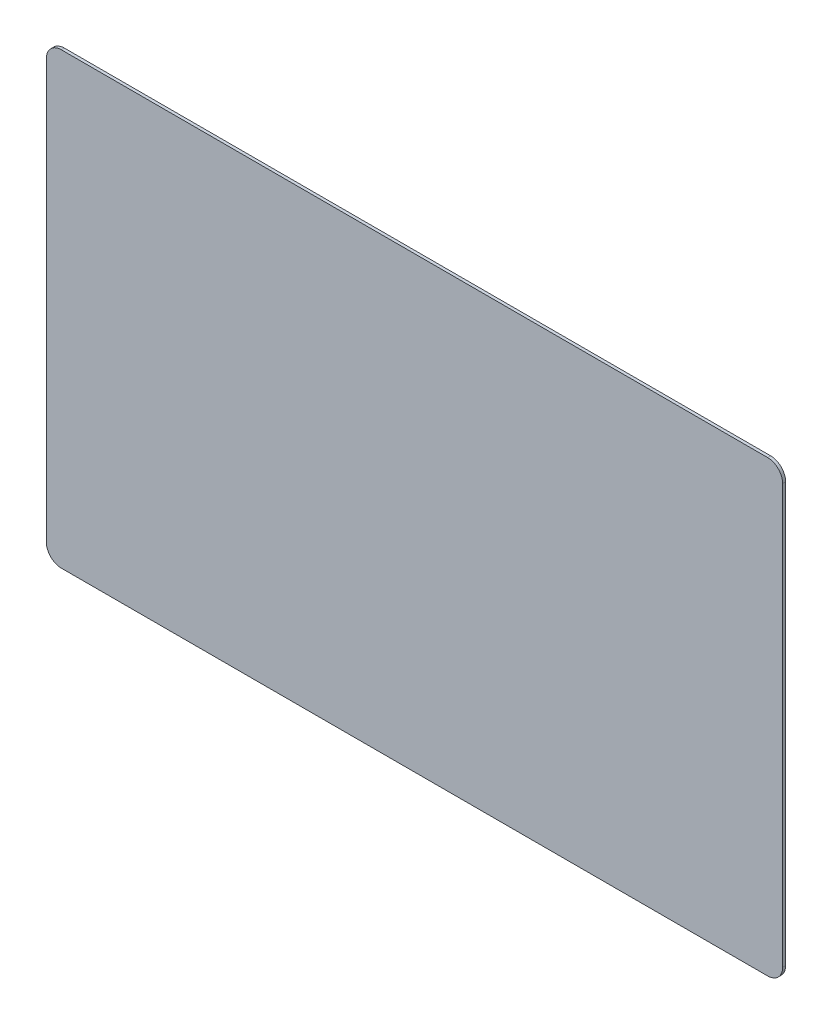
ISO-10303-21;
HEADER;
FILE_DESCRIPTION(('STEP AP214'),'2;1');
FILE_NAME('part.step','',(''),(''),'','','');
FILE_SCHEMA(('AUTOMOTIVE_DESIGN { 1 0 10303 214 1 1 1 1 }'));
ENDSEC;
DATA;
#1=APPLICATION_CONTEXT('core data for automotive mechanical design processes');
#2=APPLICATION_PROTOCOL_DEFINITION('international standard','automotive_design',2000,#1);
#3=PRODUCT_CONTEXT('',#1,'mechanical');
#4=PRODUCT('Part','Part','',(#3));
#5=PRODUCT_RELATED_PRODUCT_CATEGORY('part','',(#4));
#6=PRODUCT_DEFINITION_FORMATION('','',#4);
#7=PRODUCT_DEFINITION_CONTEXT('part definition',#1,'design');
#8=PRODUCT_DEFINITION('design','',#6,#7);
#9=PRODUCT_DEFINITION_SHAPE('','',#8);
#10=(LENGTH_UNIT() NAMED_UNIT(*) SI_UNIT(.MILLI.,.METRE.));
#11=(NAMED_UNIT(*) PLANE_ANGLE_UNIT() SI_UNIT($,.RADIAN.));
#12=(NAMED_UNIT(*) SI_UNIT($,.STERADIAN.) SOLID_ANGLE_UNIT());
#13=UNCERTAINTY_MEASURE_WITH_UNIT(LENGTH_MEASURE(1.E-05),#10,'distance_accuracy_value','');
#14=(GEOMETRIC_REPRESENTATION_CONTEXT(3) GLOBAL_UNCERTAINTY_ASSIGNED_CONTEXT((#13)) GLOBAL_UNIT_ASSIGNED_CONTEXT((#10,
#11,#12)) REPRESENTATION_CONTEXT('',''));
#15=CARTESIAN_POINT('',(0.,0.,0.));
#16=DIRECTION('',(0.,0.,1.));
#17=DIRECTION('',(1.,0.,0.));
#18=AXIS2_PLACEMENT_3D('',#15,#16,#17);
#19=CARTESIAN_POINT('',(-246.000000000061,-734.000000000027,2.));
#20=DIRECTION('',(0.,1.,0.));
#21=DIRECTION('',(0.,0.,1.));
#22=AXIS2_PLACEMENT_3D('',#19,#20,#21);
#23=PLANE('',#22);
#24=DIRECTION('',(1.,0.,0.));
#25=VECTOR('',#24,1.);
#26=CARTESIAN_POINT('',(-246.000000000061,-734.000000000027,2.));
#27=LINE('',#26,#25);
#28=CARTESIAN_POINT('',(-236.000000000061,-734.000000000027,2.));
#29=VERTEX_POINT('',#28);
#30=CARTESIAN_POINT('',(235.999999999987,-734.000000000027,2.));
#31=VERTEX_POINT('',#30);
#32=EDGE_CURVE('E123',#29,#31,#27,.T.);
#33=ORIENTED_EDGE('',*,*,#32,.F.);
#34=DIRECTION('',(0.,0.,-1.));
#35=VECTOR('',#34,1.);
#36=CARTESIAN_POINT('',(-236.000000000061,-734.000000000027,0.));
#37=LINE('',#36,#35);
#38=CARTESIAN_POINT('',(-236.000000000061,-734.000000000027,0.));
#39=VERTEX_POINT('',#38);
#40=EDGE_CURVE('E108',#29,#39,#37,.T.);
#41=ORIENTED_EDGE('',*,*,#40,.T.);
#42=DIRECTION('',(1.,0.,0.));
#43=VECTOR('',#42,1.);
#44=CARTESIAN_POINT('',(-246.000000000061,-734.000000000027,0.));
#45=LINE('',#44,#43);
#46=CARTESIAN_POINT('',(235.999999999987,-734.000000000027,0.));
#47=VERTEX_POINT('',#46);
#48=EDGE_CURVE('E120',#39,#47,#45,.T.);
#49=ORIENTED_EDGE('',*,*,#48,.T.);
#50=DIRECTION('',(0.,0.,-1.));
#51=VECTOR('',#50,1.);
#52=CARTESIAN_POINT('',(235.999999999987,-734.000000000027,2.));
#53=LINE('',#52,#51);
#54=EDGE_CURVE('E125',#47,#31,#53,.F.);
#55=ORIENTED_EDGE('',*,*,#54,.T.);
#56=EDGE_LOOP('',(#33,#41,#49,#55));
#57=FACE_BOUND('',#56,.T.);
#58=ADVANCED_FACE('F38',(#57),#23,.F.);
#59=CARTESIAN_POINT('',(245.999999999987,-734.000000000027,2.));
#60=DIRECTION('',(-1.,0.,0.));
#61=DIRECTION('',(0.,-1.,0.));
#62=AXIS2_PLACEMENT_3D('',#59,#60,#61);
#63=PLANE('',#62);
#64=DIRECTION('',(0.,1.,0.));
#65=VECTOR('',#64,1.);
#66=CARTESIAN_POINT('',(245.999999999987,-734.000000000027,2.));
#67=LINE('',#66,#65);
#68=CARTESIAN_POINT('',(245.999999999987,-724.000000000027,2.));
#69=VERTEX_POINT('',#68);
#70=CARTESIAN_POINT('',(245.999999999987,-444.00000000004,2.));
#71=VERTEX_POINT('',#70);
#72=EDGE_CURVE('E167',#69,#71,#67,.T.);
#73=ORIENTED_EDGE('',*,*,#72,.F.);
#74=DIRECTION('',(0.,0.,-1.));
#75=VECTOR('',#74,1.);
#76=CARTESIAN_POINT('',(245.999999999987,-724.000000000027,2.));
#77=LINE('',#76,#75);
#78=CARTESIAN_POINT('',(245.999999999987,-724.000000000027,0.));
#79=VERTEX_POINT('',#78);
#80=EDGE_CURVE('E182',#69,#79,#77,.T.);
#81=ORIENTED_EDGE('',*,*,#80,.T.);
#82=DIRECTION('',(0.,1.,0.));
#83=VECTOR('',#82,1.);
#84=CARTESIAN_POINT('',(245.999999999987,-734.000000000027,0.));
#85=LINE('',#84,#83);
#86=CARTESIAN_POINT('',(245.999999999987,-444.00000000004,0.));
#87=VERTEX_POINT('',#86);
#88=EDGE_CURVE('E129',#79,#87,#85,.T.);
#89=ORIENTED_EDGE('',*,*,#88,.T.);
#90=DIRECTION('',(0.,0.,-1.));
#91=VECTOR('',#90,1.);
#92=CARTESIAN_POINT('',(245.999999999987,-444.00000000004,2.));
#93=LINE('',#92,#91);
#94=EDGE_CURVE('E180',#87,#71,#93,.F.);
#95=ORIENTED_EDGE('',*,*,#94,.T.);
#96=EDGE_LOOP('',(#73,#81,#89,#95));
#97=FACE_BOUND('',#96,.T.);
#98=ADVANCED_FACE('F187',(#97),#63,.F.);
#99=CARTESIAN_POINT('',(-246.000000000061,-434.00000000004,2.));
#100=DIRECTION('',(0.,1.,0.));
#101=DIRECTION('',(0.,0.,1.));
#102=AXIS2_PLACEMENT_3D('',#99,#100,#101);
#103=PLANE('',#102);
#104=DIRECTION('',(1.,0.,0.));
#105=VECTOR('',#104,1.);
#106=CARTESIAN_POINT('',(-246.000000000061,-434.00000000004,2.));
#107=LINE('',#106,#105);
#108=CARTESIAN_POINT('',(-236.000000000061,-434.00000000004,2.));
#109=VERTEX_POINT('',#108);
#110=CARTESIAN_POINT('',(235.999999999987,-434.00000000004,2.));
#111=VERTEX_POINT('',#110);
#112=EDGE_CURVE('E164',#109,#111,#107,.T.);
#113=ORIENTED_EDGE('',*,*,#112,.T.);
#114=DIRECTION('',(0.,0.,-1.));
#115=VECTOR('',#114,1.);
#116=CARTESIAN_POINT('',(235.999999999987,-434.00000000004,0.));
#117=LINE('',#116,#115);
#118=CARTESIAN_POINT('',(235.999999999987,-434.00000000004,0.));
#119=VERTEX_POINT('',#118);
#120=EDGE_CURVE('E12',#111,#119,#117,.T.);
#121=ORIENTED_EDGE('',*,*,#120,.T.);
#122=DIRECTION('',(1.,0.,0.));
#123=VECTOR('',#122,1.);
#124=CARTESIAN_POINT('',(-246.000000000061,-434.00000000004,0.));
#125=LINE('',#124,#123);
#126=CARTESIAN_POINT('',(-236.000000000061,-434.00000000004,0.));
#127=VERTEX_POINT('',#126);
#128=EDGE_CURVE('E132',#127,#119,#125,.T.);
#129=ORIENTED_EDGE('',*,*,#128,.F.);
#130=DIRECTION('',(0.,0.,-1.));
#131=VECTOR('',#130,1.);
#132=CARTESIAN_POINT('',(-236.000000000061,-434.00000000004,2.));
#133=LINE('',#132,#131);
#134=EDGE_CURVE('E46',#127,#109,#133,.F.);
#135=ORIENTED_EDGE('',*,*,#134,.T.);
#136=EDGE_LOOP('',(#113,#121,#129,#135));
#137=FACE_BOUND('',#136,.T.);
#138=ADVANCED_FACE('F194',(#137),#103,.T.);
#139=CARTESIAN_POINT('',(-246.000000000061,-734.000000000027,2.));
#140=DIRECTION('',(-1.,0.,0.));
#141=DIRECTION('',(0.,0.,1.));
#142=AXIS2_PLACEMENT_3D('',#139,#140,#141);
#143=PLANE('',#142);
#144=DIRECTION('',(0.,1.,0.));
#145=VECTOR('',#144,1.);
#146=CARTESIAN_POINT('',(-246.000000000061,-734.000000000027,0.));
#147=LINE('',#146,#145);
#148=CARTESIAN_POINT('',(-246.000000000061,-724.000000000027,0.));
#149=VERTEX_POINT('',#148);
#150=CARTESIAN_POINT('',(-246.000000000061,-444.00000000004,0.));
#151=VERTEX_POINT('',#150);
#152=EDGE_CURVE('E141',#149,#151,#147,.T.);
#153=ORIENTED_EDGE('',*,*,#152,.F.);
#154=DIRECTION('',(0.,0.,-1.));
#155=VECTOR('',#154,1.);
#156=CARTESIAN_POINT('',(-246.000000000061,-724.000000000027,2.));
#157=LINE('',#156,#155);
#158=CARTESIAN_POINT('',(-246.000000000061,-724.000000000027,2.));
#159=VERTEX_POINT('',#158);
#160=EDGE_CURVE('E109',#149,#159,#157,.F.);
#161=ORIENTED_EDGE('',*,*,#160,.T.);
#162=DIRECTION('',(0.,1.,0.));
#163=VECTOR('',#162,1.);
#164=CARTESIAN_POINT('',(-246.000000000061,-734.000000000027,2.));
#165=LINE('',#164,#163);
#166=CARTESIAN_POINT('',(-246.000000000061,-444.00000000004,2.));
#167=VERTEX_POINT('',#166);
#168=EDGE_CURVE('E135',#159,#167,#165,.T.);
#169=ORIENTED_EDGE('',*,*,#168,.T.);
#170=DIRECTION('',(0.,0.,-1.));
#171=VECTOR('',#170,1.);
#172=CARTESIAN_POINT('',(-246.000000000061,-444.00000000004,2.));
#173=LINE('',#172,#171);
#174=EDGE_CURVE('E114',#167,#151,#173,.T.);
#175=ORIENTED_EDGE('',*,*,#174,.T.);
#176=EDGE_LOOP('',(#153,#161,#169,#175));
#177=FACE_BOUND('',#176,.T.);
#178=ADVANCED_FACE('F202',(#177),#143,.T.);
#179=CARTESIAN_POINT('',(0.,0.,2.));
#180=DIRECTION('',(0.,0.,1.));
#181=DIRECTION('',(1.,0.,0.));
#182=AXIS2_PLACEMENT_3D('',#179,#180,#181);
#183=PLANE('',#182);
#184=ORIENTED_EDGE('',*,*,#168,.F.);
#185=CARTESIAN_POINT('',(-236.000000000061,-724.000000000027,2.));
#186=DIRECTION('',(0.,0.,1.));
#187=DIRECTION('',(1.,0.,0.));
#188=AXIS2_PLACEMENT_3D('',#185,#186,#187);
#189=CIRCLE('',#188,10.);
#190=EDGE_CURVE('E176',#159,#29,#189,.T.);
#191=ORIENTED_EDGE('',*,*,#190,.T.);
#192=ORIENTED_EDGE('',*,*,#32,.T.);
#193=CARTESIAN_POINT('',(235.999999999987,-724.000000000027,2.));
#194=DIRECTION('',(0.,0.,1.));
#195=DIRECTION('',(1.,0.,0.));
#196=AXIS2_PLACEMENT_3D('',#193,#194,#195);
#197=CIRCLE('',#196,10.);
#198=EDGE_CURVE('E157',#31,#69,#197,.T.);
#199=ORIENTED_EDGE('',*,*,#198,.T.);
#200=ORIENTED_EDGE('',*,*,#72,.T.);
#201=CARTESIAN_POINT('',(235.999999999987,-444.00000000004,2.));
#202=DIRECTION('',(0.,0.,1.));
#203=DIRECTION('',(1.,0.,0.));
#204=AXIS2_PLACEMENT_3D('',#201,#202,#203);
#205=CIRCLE('',#204,10.);
#206=EDGE_CURVE('E53',#71,#111,#205,.T.);
#207=ORIENTED_EDGE('',*,*,#206,.T.);
#208=ORIENTED_EDGE('',*,*,#112,.F.);
#209=CARTESIAN_POINT('',(-236.000000000061,-444.00000000004,2.));
#210=DIRECTION('',(0.,0.,1.));
#211=DIRECTION('',(1.,0.,0.));
#212=AXIS2_PLACEMENT_3D('',#209,#210,#211);
#213=CIRCLE('',#212,10.);
#214=EDGE_CURVE('E150',#109,#167,#213,.T.);
#215=ORIENTED_EDGE('',*,*,#214,.T.);
#216=EDGE_LOOP('',(#184,#191,#192,#199,#200,#207,#208,#215));
#217=FACE_BOUND('',#216,.T.);
#218=ADVANCED_FACE('F197',(#217),#183,.T.);
#219=CARTESIAN_POINT('',(0.,0.,0.));
#220=DIRECTION('',(0.,0.,1.));
#221=DIRECTION('',(1.,0.,0.));
#222=AXIS2_PLACEMENT_3D('',#219,#220,#221);
#223=PLANE('',#222);
#224=ORIENTED_EDGE('',*,*,#48,.F.);
#225=CARTESIAN_POINT('',(-236.000000000061,-724.000000000027,0.));
#226=DIRECTION('',(0.,0.,1.));
#227=DIRECTION('',(1.,0.,0.));
#228=AXIS2_PLACEMENT_3D('',#225,#226,#227);
#229=CIRCLE('',#228,10.);
#230=EDGE_CURVE('E104',#39,#149,#229,.F.);
#231=ORIENTED_EDGE('',*,*,#230,.T.);
#232=ORIENTED_EDGE('',*,*,#152,.T.);
#233=CARTESIAN_POINT('',(-236.000000000061,-444.00000000004,0.));
#234=DIRECTION('',(0.,0.,1.));
#235=DIRECTION('',(1.,0.,0.));
#236=AXIS2_PLACEMENT_3D('',#233,#234,#235);
#237=CIRCLE('',#236,10.);
#238=EDGE_CURVE('E124',#151,#127,#237,.F.);
#239=ORIENTED_EDGE('',*,*,#238,.T.);
#240=ORIENTED_EDGE('',*,*,#128,.T.);
#241=CARTESIAN_POINT('',(235.999999999987,-444.00000000004,0.));
#242=DIRECTION('',(0.,0.,1.));
#243=DIRECTION('',(1.,0.,0.));
#244=AXIS2_PLACEMENT_3D('',#241,#242,#243);
#245=CIRCLE('',#244,10.);
#246=EDGE_CURVE('E145',#119,#87,#245,.F.);
#247=ORIENTED_EDGE('',*,*,#246,.T.);
#248=ORIENTED_EDGE('',*,*,#88,.F.);
#249=CARTESIAN_POINT('',(235.999999999987,-724.000000000027,0.));
#250=DIRECTION('',(0.,0.,1.));
#251=DIRECTION('',(1.,0.,0.));
#252=AXIS2_PLACEMENT_3D('',#249,#250,#251);
#253=CIRCLE('',#252,10.);
#254=EDGE_CURVE('E115',#79,#47,#253,.F.);
#255=ORIENTED_EDGE('',*,*,#254,.T.);
#256=EDGE_LOOP('',(#224,#231,#232,#239,#240,#247,#248,#255));
#257=FACE_BOUND('',#256,.T.);
#258=ADVANCED_FACE('F127',(#257),#223,.F.);
#259=CARTESIAN_POINT('',(-236.000000000061,-724.000000000027,2.));
#260=DIRECTION('',(0.,0.,1.));
#261=DIRECTION('',(1.,0.,0.));
#262=AXIS2_PLACEMENT_3D('',#259,#260,#261);
#263=CYLINDRICAL_SURFACE('',#262,10.);
#264=ORIENTED_EDGE('',*,*,#190,.F.);
#265=ORIENTED_EDGE('',*,*,#160,.F.);
#266=ORIENTED_EDGE('',*,*,#230,.F.);
#267=ORIENTED_EDGE('',*,*,#40,.F.);
#268=EDGE_LOOP('',(#264,#265,#266,#267));
#269=FACE_BOUND('',#268,.T.);
#270=ADVANCED_FACE('F107',(#269),#263,.T.);
#271=CARTESIAN_POINT('',(235.999999999987,-724.000000000027,2.));
#272=DIRECTION('',(0.,0.,-1.));
#273=DIRECTION('',(-1.,0.,0.));
#274=AXIS2_PLACEMENT_3D('',#271,#272,#273);
#275=CYLINDRICAL_SURFACE('',#274,10.);
#276=ORIENTED_EDGE('',*,*,#198,.F.);
#277=ORIENTED_EDGE('',*,*,#54,.F.);
#278=ORIENTED_EDGE('',*,*,#254,.F.);
#279=ORIENTED_EDGE('',*,*,#80,.F.);
#280=EDGE_LOOP('',(#276,#277,#278,#279));
#281=FACE_BOUND('',#280,.T.);
#282=ADVANCED_FACE('F205',(#281),#275,.T.);
#283=CARTESIAN_POINT('',(235.999999999987,-444.00000000004,2.));
#284=DIRECTION('',(0.,0.,1.));
#285=DIRECTION('',(1.,0.,0.));
#286=AXIS2_PLACEMENT_3D('',#283,#284,#285);
#287=CYLINDRICAL_SURFACE('',#286,10.);
#288=ORIENTED_EDGE('',*,*,#206,.F.);
#289=ORIENTED_EDGE('',*,*,#94,.F.);
#290=ORIENTED_EDGE('',*,*,#246,.F.);
#291=ORIENTED_EDGE('',*,*,#120,.F.);
#292=EDGE_LOOP('',(#288,#289,#290,#291));
#293=FACE_BOUND('',#292,.T.);
#294=ADVANCED_FACE('F193',(#293),#287,.T.);
#295=CARTESIAN_POINT('',(-236.000000000061,-444.00000000004,2.));
#296=DIRECTION('',(0.,0.,-1.));
#297=DIRECTION('',(-1.,0.,0.));
#298=AXIS2_PLACEMENT_3D('',#295,#296,#297);
#299=CYLINDRICAL_SURFACE('',#298,10.);
#300=ORIENTED_EDGE('',*,*,#214,.F.);
#301=ORIENTED_EDGE('',*,*,#134,.F.);
#302=ORIENTED_EDGE('',*,*,#238,.F.);
#303=ORIENTED_EDGE('',*,*,#174,.F.);
#304=EDGE_LOOP('',(#300,#301,#302,#303));
#305=FACE_BOUND('',#304,.T.);
#306=ADVANCED_FACE('F40',(#305),#299,.T.);
#307=CLOSED_SHELL('',(#58,#98,#138,#178,#218,#258,#270,#282,#294,#306));
#308=MANIFOLD_SOLID_BREP('B2',#307);
#309=ADVANCED_BREP_SHAPE_REPRESENTATION('',(#18,#308),#14);
#310=SHAPE_DEFINITION_REPRESENTATION(#9,#309);
ENDSEC;
END-ISO-10303-21;
